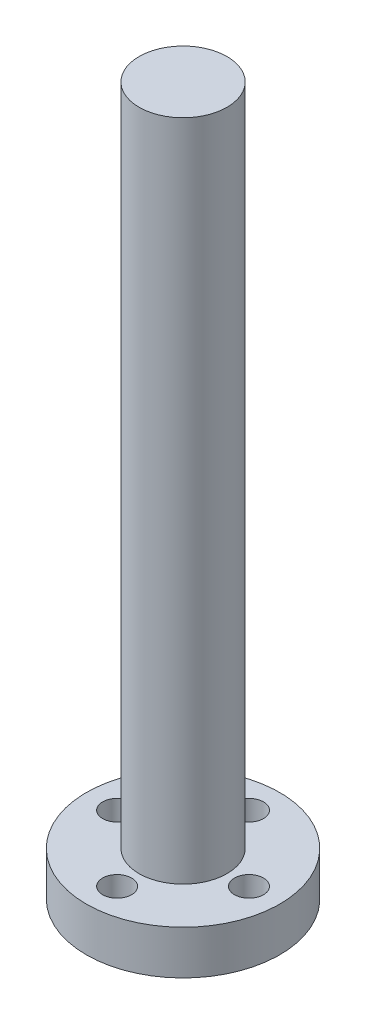
ISO-10303-21;
HEADER;
FILE_DESCRIPTION(('STEP AP214'),'2;1');
FILE_NAME('part.step','',(''),(''),'','','');
FILE_SCHEMA(('AUTOMOTIVE_DESIGN { 1 0 10303 214 1 1 1 1 }'));
ENDSEC;
DATA;
#1=APPLICATION_CONTEXT('core data for automotive mechanical design processes');
#2=APPLICATION_PROTOCOL_DEFINITION('international standard','automotive_design',2000,#1);
#3=PRODUCT_CONTEXT('',#1,'mechanical');
#4=PRODUCT('Part','Part','',(#3));
#5=PRODUCT_RELATED_PRODUCT_CATEGORY('part','',(#4));
#6=PRODUCT_DEFINITION_FORMATION('','',#4);
#7=PRODUCT_DEFINITION_CONTEXT('part definition',#1,'design');
#8=PRODUCT_DEFINITION('design','',#6,#7);
#9=PRODUCT_DEFINITION_SHAPE('','',#8);
#10=(LENGTH_UNIT() NAMED_UNIT(*) SI_UNIT(.MILLI.,.METRE.));
#11=(NAMED_UNIT(*) PLANE_ANGLE_UNIT() SI_UNIT($,.RADIAN.));
#12=(NAMED_UNIT(*) SI_UNIT($,.STERADIAN.) SOLID_ANGLE_UNIT());
#13=UNCERTAINTY_MEASURE_WITH_UNIT(LENGTH_MEASURE(1.E-05),#10,'distance_accuracy_value','');
#14=(GEOMETRIC_REPRESENTATION_CONTEXT(3) GLOBAL_UNCERTAINTY_ASSIGNED_CONTEXT((#13)) GLOBAL_UNIT_ASSIGNED_CONTEXT((#10,
#11,#12)) REPRESENTATION_CONTEXT('',''));
#15=CARTESIAN_POINT('',(0.,0.,0.));
#16=DIRECTION('',(0.,0.,1.));
#17=DIRECTION('',(1.,0.,0.));
#18=AXIS2_PLACEMENT_3D('',#15,#16,#17);
#19=CARTESIAN_POINT('',(0.,161.,0.));
#20=DIRECTION('',(0.,-1.,0.));
#21=DIRECTION('',(0.,0.,-1.));
#22=AXIS2_PLACEMENT_3D('',#19,#20,#21);
#23=CYLINDRICAL_SURFACE('',#22,10.);
#24=CARTESIAN_POINT('',(0.,10.,0.));
#25=DIRECTION('',(0.,1.,0.));
#26=DIRECTION('',(0.,0.,1.));
#27=AXIS2_PLACEMENT_3D('',#24,#25,#26);
#28=CIRCLE('',#27,10.);
#29=CARTESIAN_POINT('',(0.,10.,10.));
#30=VERTEX_POINT('',#29);
#31=EDGE_CURVE('E37',#30,#30,#28,.T.);
#32=ORIENTED_EDGE('',*,*,#31,.T.);
#33=EDGE_LOOP('',(#32));
#34=FACE_BOUND('',#33,.T.);
#35=CARTESIAN_POINT('',(0.,161.,0.));
#36=DIRECTION('',(0.,1.,0.));
#37=DIRECTION('',(0.,0.,1.));
#38=AXIS2_PLACEMENT_3D('',#35,#36,#37);
#39=CIRCLE('',#38,10.);
#40=CARTESIAN_POINT('',(0.,161.,10.));
#41=VERTEX_POINT('',#40);
#42=EDGE_CURVE('E10',#41,#41,#39,.T.);
#43=ORIENTED_EDGE('',*,*,#42,.F.);
#44=EDGE_LOOP('',(#43));
#45=FACE_BOUND('',#44,.T.);
#46=ADVANCED_FACE('F40',(#34,#45),#23,.T.);
#47=CARTESIAN_POINT('',(0.,161.,0.));
#48=DIRECTION('',(0.,1.,0.));
#49=DIRECTION('',(0.,0.,1.));
#50=AXIS2_PLACEMENT_3D('',#47,#48,#49);
#51=PLANE('',#50);
#52=ORIENTED_EDGE('',*,*,#42,.T.);
#53=EDGE_LOOP('',(#52));
#54=FACE_BOUND('',#53,.T.);
#55=ADVANCED_FACE('F82',(#54),#51,.T.);
#56=CARTESIAN_POINT('',(0.,10.,0.));
#57=DIRECTION('',(0.,1.,0.));
#58=DIRECTION('',(0.,0.,1.));
#59=AXIS2_PLACEMENT_3D('',#56,#57,#58);
#60=PLANE('',#59);
#61=ORIENTED_EDGE('',*,*,#31,.F.);
#62=EDGE_LOOP('',(#61));
#63=FACE_BOUND('',#62,.T.);
#64=CARTESIAN_POINT('',(0.,10.,15.));
#65=DIRECTION('',(0.,1.,0.));
#66=DIRECTION('',(0.,0.,1.));
#67=AXIS2_PLACEMENT_3D('',#64,#65,#66);
#68=CIRCLE('',#67,3.3);
#69=CARTESIAN_POINT('',(0.,10.,18.3));
#70=VERTEX_POINT('',#69);
#71=EDGE_CURVE('E62',#70,#70,#68,.T.);
#72=ORIENTED_EDGE('',*,*,#71,.F.);
#73=EDGE_LOOP('',(#72));
#74=FACE_BOUND('',#73,.T.);
#75=CARTESIAN_POINT('',(-15.,10.,0.));
#76=DIRECTION('',(0.,1.,0.));
#77=DIRECTION('',(0.,0.,1.));
#78=AXIS2_PLACEMENT_3D('',#75,#76,#77);
#79=CIRCLE('',#78,3.3);
#80=CARTESIAN_POINT('',(-15.,10.,3.3));
#81=VERTEX_POINT('',#80);
#82=EDGE_CURVE('E55',#81,#81,#79,.T.);
#83=ORIENTED_EDGE('',*,*,#82,.F.);
#84=EDGE_LOOP('',(#83));
#85=FACE_BOUND('',#84,.T.);
#86=CARTESIAN_POINT('',(0.,10.,0.));
#87=DIRECTION('',(0.,1.,0.));
#88=DIRECTION('',(0.,0.,1.));
#89=AXIS2_PLACEMENT_3D('',#86,#87,#88);
#90=CIRCLE('',#89,22.);
#91=CARTESIAN_POINT('',(0.,10.,22.));
#92=VERTEX_POINT('',#91);
#93=EDGE_CURVE('E50',#92,#92,#90,.T.);
#94=ORIENTED_EDGE('',*,*,#93,.T.);
#95=EDGE_LOOP('',(#94));
#96=FACE_BOUND('',#95,.T.);
#97=CARTESIAN_POINT('',(15.,10.,0.));
#98=DIRECTION('',(0.,1.,0.));
#99=DIRECTION('',(0.,0.,1.));
#100=AXIS2_PLACEMENT_3D('',#97,#98,#99);
#101=CIRCLE('',#100,3.3);
#102=CARTESIAN_POINT('',(15.,10.,3.3));
#103=VERTEX_POINT('',#102);
#104=EDGE_CURVE('E59',#103,#103,#101,.T.);
#105=ORIENTED_EDGE('',*,*,#104,.F.);
#106=EDGE_LOOP('',(#105));
#107=FACE_BOUND('',#106,.T.);
#108=CARTESIAN_POINT('',(0.,10.,-15.));
#109=DIRECTION('',(0.,1.,0.));
#110=DIRECTION('',(0.,0.,1.));
#111=AXIS2_PLACEMENT_3D('',#108,#109,#110);
#112=CIRCLE('',#111,3.3);
#113=CARTESIAN_POINT('',(0.,10.,-11.7));
#114=VERTEX_POINT('',#113);
#115=EDGE_CURVE('E68',#114,#114,#112,.T.);
#116=ORIENTED_EDGE('',*,*,#115,.F.);
#117=EDGE_LOOP('',(#116));
#118=FACE_BOUND('',#117,.T.);
#119=ADVANCED_FACE('F85',(#63,#74,#85,#96,#107,#118),#60,.T.);
#120=CARTESIAN_POINT('',(0.,10.,0.));
#121=DIRECTION('',(0.,-1.,0.));
#122=DIRECTION('',(0.,0.,-1.));
#123=AXIS2_PLACEMENT_3D('',#120,#121,#122);
#124=CYLINDRICAL_SURFACE('',#123,22.);
#125=ORIENTED_EDGE('',*,*,#93,.F.);
#126=EDGE_LOOP('',(#125));
#127=FACE_BOUND('',#126,.T.);
#128=CARTESIAN_POINT('',(0.,0.,0.));
#129=DIRECTION('',(0.,1.,0.));
#130=DIRECTION('',(0.,0.,1.));
#131=AXIS2_PLACEMENT_3D('',#128,#129,#130);
#132=CIRCLE('',#131,22.);
#133=CARTESIAN_POINT('',(0.,0.,22.));
#134=VERTEX_POINT('',#133);
#135=EDGE_CURVE('E47',#134,#134,#132,.T.);
#136=ORIENTED_EDGE('',*,*,#135,.T.);
#137=EDGE_LOOP('',(#136));
#138=FACE_BOUND('',#137,.T.);
#139=ADVANCED_FACE('F84',(#127,#138),#124,.T.);
#140=CARTESIAN_POINT('',(-15.,10.,0.));
#141=DIRECTION('',(0.,-1.,0.));
#142=DIRECTION('',(0.,0.,-1.));
#143=AXIS2_PLACEMENT_3D('',#140,#141,#142);
#144=CYLINDRICAL_SURFACE('',#143,3.3);
#145=ORIENTED_EDGE('',*,*,#82,.T.);
#146=EDGE_LOOP('',(#145));
#147=FACE_BOUND('',#146,.T.);
#148=CARTESIAN_POINT('',(-15.,0.,0.));
#149=DIRECTION('',(0.,1.,0.));
#150=DIRECTION('',(0.,0.,1.));
#151=AXIS2_PLACEMENT_3D('',#148,#149,#150);
#152=CIRCLE('',#151,3.3);
#153=CARTESIAN_POINT('',(-15.,0.,3.3));
#154=VERTEX_POINT('',#153);
#155=EDGE_CURVE('E54',#154,#154,#152,.T.);
#156=ORIENTED_EDGE('',*,*,#155,.F.);
#157=EDGE_LOOP('',(#156));
#158=FACE_BOUND('',#157,.T.);
#159=ADVANCED_FACE('F95',(#147,#158),#144,.F.);
#160=CARTESIAN_POINT('',(15.,10.,0.));
#161=DIRECTION('',(0.,-1.,0.));
#162=DIRECTION('',(0.,0.,-1.));
#163=AXIS2_PLACEMENT_3D('',#160,#161,#162);
#164=CYLINDRICAL_SURFACE('',#163,3.3);
#165=ORIENTED_EDGE('',*,*,#104,.T.);
#166=EDGE_LOOP('',(#165));
#167=FACE_BOUND('',#166,.T.);
#168=CARTESIAN_POINT('',(15.,0.,0.));
#169=DIRECTION('',(0.,1.,0.));
#170=DIRECTION('',(0.,0.,1.));
#171=AXIS2_PLACEMENT_3D('',#168,#169,#170);
#172=CIRCLE('',#171,3.3);
#173=CARTESIAN_POINT('',(15.,0.,3.3));
#174=VERTEX_POINT('',#173);
#175=EDGE_CURVE('E63',#174,#174,#172,.T.);
#176=ORIENTED_EDGE('',*,*,#175,.F.);
#177=EDGE_LOOP('',(#176));
#178=FACE_BOUND('',#177,.T.);
#179=ADVANCED_FACE('F141',(#167,#178),#164,.F.);
#180=CARTESIAN_POINT('',(0.,10.,15.));
#181=DIRECTION('',(0.,-1.,0.));
#182=DIRECTION('',(0.,0.,-1.));
#183=AXIS2_PLACEMENT_3D('',#180,#181,#182);
#184=CYLINDRICAL_SURFACE('',#183,3.3);
#185=ORIENTED_EDGE('',*,*,#71,.T.);
#186=EDGE_LOOP('',(#185));
#187=FACE_BOUND('',#186,.T.);
#188=CARTESIAN_POINT('',(0.,0.,15.));
#189=DIRECTION('',(0.,1.,0.));
#190=DIRECTION('',(0.,0.,1.));
#191=AXIS2_PLACEMENT_3D('',#188,#189,#190);
#192=CIRCLE('',#191,3.3);
#193=CARTESIAN_POINT('',(0.,0.,18.3));
#194=VERTEX_POINT('',#193);
#195=EDGE_CURVE('E70',#194,#194,#192,.T.);
#196=ORIENTED_EDGE('',*,*,#195,.F.);
#197=EDGE_LOOP('',(#196));
#198=FACE_BOUND('',#197,.T.);
#199=ADVANCED_FACE('F148',(#187,#198),#184,.F.);
#200=CARTESIAN_POINT('',(0.,10.,-15.));
#201=DIRECTION('',(0.,-1.,0.));
#202=DIRECTION('',(0.,0.,-1.));
#203=AXIS2_PLACEMENT_3D('',#200,#201,#202);
#204=CYLINDRICAL_SURFACE('',#203,3.3);
#205=ORIENTED_EDGE('',*,*,#115,.T.);
#206=EDGE_LOOP('',(#205));
#207=FACE_BOUND('',#206,.T.);
#208=CARTESIAN_POINT('',(0.,0.,-15.));
#209=DIRECTION('',(0.,1.,0.));
#210=DIRECTION('',(0.,0.,1.));
#211=AXIS2_PLACEMENT_3D('',#208,#209,#210);
#212=CIRCLE('',#211,3.3);
#213=CARTESIAN_POINT('',(0.,0.,-11.7));
#214=VERTEX_POINT('',#213);
#215=EDGE_CURVE('E71',#214,#214,#212,.T.);
#216=ORIENTED_EDGE('',*,*,#215,.F.);
#217=EDGE_LOOP('',(#216));
#218=FACE_BOUND('',#217,.T.);
#219=ADVANCED_FACE('F80',(#207,#218),#204,.F.);
#220=CARTESIAN_POINT('',(0.,0.,0.));
#221=DIRECTION('',(0.,1.,0.));
#222=DIRECTION('',(0.,0.,1.));
#223=AXIS2_PLACEMENT_3D('',#220,#221,#222);
#224=PLANE('',#223);
#225=ORIENTED_EDGE('',*,*,#135,.F.);
#226=EDGE_LOOP('',(#225));
#227=FACE_BOUND('',#226,.T.);
#228=ORIENTED_EDGE('',*,*,#155,.T.);
#229=EDGE_LOOP('',(#228));
#230=FACE_BOUND('',#229,.T.);
#231=ORIENTED_EDGE('',*,*,#175,.T.);
#232=EDGE_LOOP('',(#231));
#233=FACE_BOUND('',#232,.T.);
#234=ORIENTED_EDGE('',*,*,#195,.T.);
#235=EDGE_LOOP('',(#234));
#236=FACE_BOUND('',#235,.T.);
#237=ORIENTED_EDGE('',*,*,#215,.T.);
#238=EDGE_LOOP('',(#237));
#239=FACE_BOUND('',#238,.T.);
#240=ADVANCED_FACE('F113',(#227,#230,#233,#236,#239),#224,.F.);
#241=CLOSED_SHELL('',(#46,#55,#119,#139,#159,#179,#199,#219,#240));
#242=MANIFOLD_SOLID_BREP('B2',#241);
#243=ADVANCED_BREP_SHAPE_REPRESENTATION('',(#18,#242),#14);
#244=SHAPE_DEFINITION_REPRESENTATION(#9,#243);
ENDSEC;
END-ISO-10303-21;
